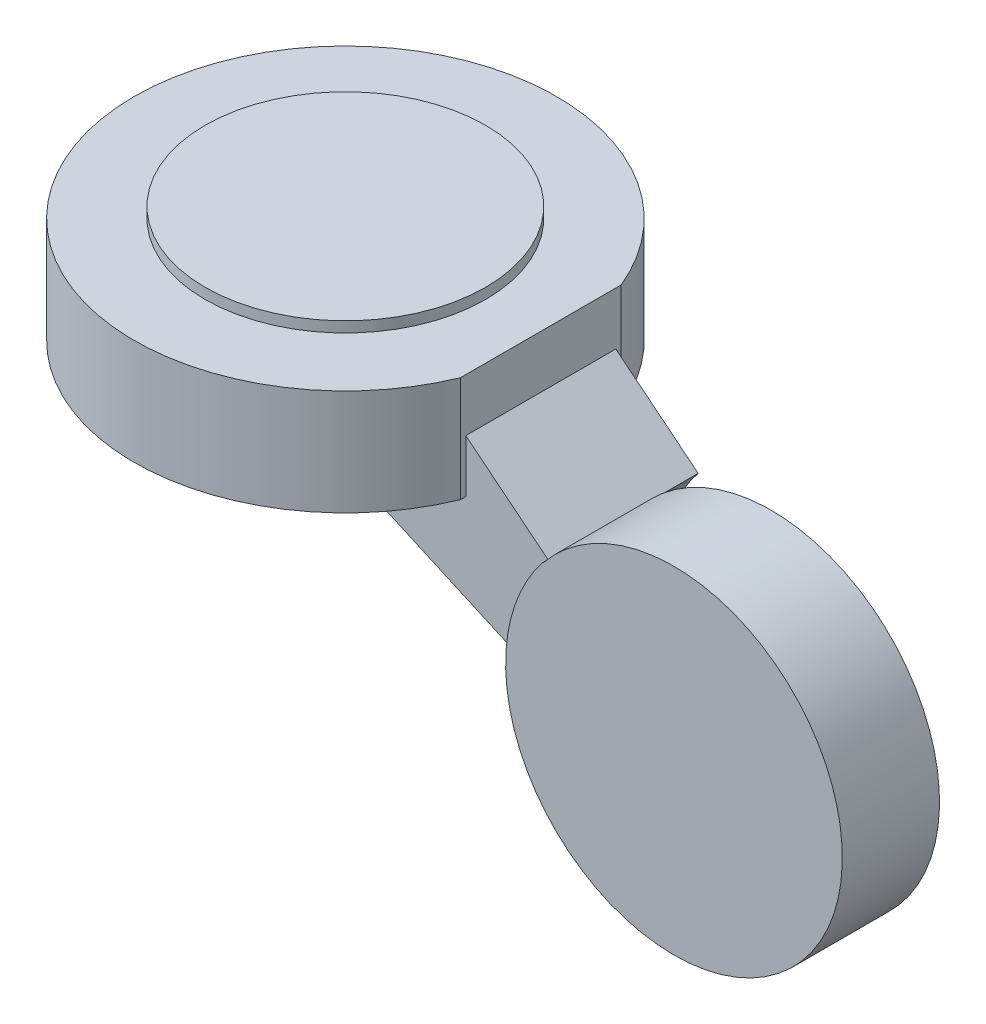
ISO-10303-21;
HEADER;
FILE_DESCRIPTION(('STEP AP214'),'2;1');
FILE_NAME('part.step','',(''),(''),'','','');
FILE_SCHEMA(('AUTOMOTIVE_DESIGN { 1 0 10303 214 1 1 1 1 }'));
ENDSEC;
DATA;
#1=APPLICATION_CONTEXT('core data for automotive mechanical design processes');
#2=APPLICATION_PROTOCOL_DEFINITION('international standard','automotive_design',2000,#1);
#3=PRODUCT_CONTEXT('',#1,'mechanical');
#4=PRODUCT('Part','Part','',(#3));
#5=PRODUCT_RELATED_PRODUCT_CATEGORY('part','',(#4));
#6=PRODUCT_DEFINITION_FORMATION('','',#4);
#7=PRODUCT_DEFINITION_CONTEXT('part definition',#1,'design');
#8=PRODUCT_DEFINITION('design','',#6,#7);
#9=PRODUCT_DEFINITION_SHAPE('','',#8);
#10=(LENGTH_UNIT() NAMED_UNIT(*) SI_UNIT(.MILLI.,.METRE.));
#11=(NAMED_UNIT(*) PLANE_ANGLE_UNIT() SI_UNIT($,.RADIAN.));
#12=(NAMED_UNIT(*) SI_UNIT($,.STERADIAN.) SOLID_ANGLE_UNIT());
#13=UNCERTAINTY_MEASURE_WITH_UNIT(LENGTH_MEASURE(1.E-05),#10,'distance_accuracy_value','');
#14=(GEOMETRIC_REPRESENTATION_CONTEXT(3) GLOBAL_UNCERTAINTY_ASSIGNED_CONTEXT((#13)) GLOBAL_UNIT_ASSIGNED_CONTEXT((#10,
#11,#12)) REPRESENTATION_CONTEXT('',''));
#15=CARTESIAN_POINT('',(0.,0.,0.));
#16=DIRECTION('',(0.,0.,1.));
#17=DIRECTION('',(1.,0.,0.));
#18=AXIS2_PLACEMENT_3D('',#15,#16,#17);
#19=CARTESIAN_POINT('',(185.,50.,-75.9934207678534));
#20=DIRECTION('',(0.627757521800335,0.778408950246015,0.));
#21=DIRECTION('',(-0.778408950246015,0.627757521800335,0.));
#22=AXIS2_PLACEMENT_3D('',#19,#20,#21);
#23=PLANE('',#22);
#24=DIRECTION('',(0.778408950246015,-0.627757521800335,0.));
#25=VECTOR('',#24,1.);
#26=CARTESIAN_POINT('',(185.,50.,-70.9934207678534));
#27=LINE('',#26,#25);
#28=CARTESIAN_POINT('',(185.,50.,-70.9934207678534));
#29=VERTEX_POINT('',#28);
#30=CARTESIAN_POINT('',(263.016769178604,-12.9175880659524,-70.9934207678534));
#31=VERTEX_POINT('',#30);
#32=EDGE_CURVE('E56',#29,#31,#27,.T.);
#33=ORIENTED_EDGE('',*,*,#32,.F.);
#34=DIRECTION('',(0.,0.,1.));
#35=VECTOR('',#34,1.);
#36=CARTESIAN_POINT('',(185.,50.,-75.9934207678534));
#37=LINE('',#36,#35);
#38=CARTESIAN_POINT('',(185.,50.,70.9934207678534));
#39=VERTEX_POINT('',#38);
#40=EDGE_CURVE('E160',#29,#39,#37,.T.);
#41=ORIENTED_EDGE('',*,*,#40,.T.);
#42=DIRECTION('',(-0.778408950246015,0.627757521800335,0.));
#43=VECTOR('',#42,1.);
#44=CARTESIAN_POINT('',(97.3373123204079,120.696658298578,70.9934207678534));
#45=LINE('',#44,#43);
#46=CARTESIAN_POINT('',(262.770904394627,-12.7193073711596,70.9934207678534));
#47=VERTEX_POINT('',#46);
#48=EDGE_CURVE('E296',#47,#39,#45,.T.);
#49=ORIENTED_EDGE('',*,*,#48,.F.);
#50=DIRECTION('',(0.,0.,1.));
#51=VECTOR('',#50,1.);
#52=CARTESIAN_POINT('',(262.770904394627,-12.7193073711596,70.9934207678534));
#53=LINE('',#52,#51);
#54=CARTESIAN_POINT('',(262.770904394627,-12.7193073711596,75.9934207678534));
#55=VERTEX_POINT('',#54);
#56=EDGE_CURVE('E199',#47,#55,#53,.T.);
#57=ORIENTED_EDGE('',*,*,#56,.T.);
#58=DIRECTION('',(-0.778408950246015,0.627757521800335,0.));
#59=VECTOR('',#58,1.);
#60=CARTESIAN_POINT('',(185.,50.,75.9934207678534));
#61=LINE('',#60,#59);
#62=CARTESIAN_POINT('',(263.016769178604,-12.9175880659524,75.9934207678534));
#63=VERTEX_POINT('',#62);
#64=EDGE_CURVE('E155',#63,#55,#61,.T.);
#65=ORIENTED_EDGE('',*,*,#64,.F.);
#66=DIRECTION('',(0.,0.,1.));
#67=VECTOR('',#66,1.);
#68=CARTESIAN_POINT('',(263.016769178604,-12.9175880659524,-75.9934207678534));
#69=LINE('',#68,#67);
#70=CARTESIAN_POINT('',(263.016769178604,-12.9175880659524,-15.9934207678534));
#71=VERTEX_POINT('',#70);
#72=EDGE_CURVE('E148',#71,#63,#69,.T.);
#73=ORIENTED_EDGE('',*,*,#72,.F.);
#74=EDGE_CURVE('E63',#31,#71,#69,.T.);
#75=ORIENTED_EDGE('',*,*,#74,.F.);
#76=EDGE_LOOP('',(#33,#41,#49,#57,#65,#73,#75));
#77=FACE_BOUND('',#76,.T.);
#78=ADVANCED_FACE('F39',(#77),#23,.T.);
#79=CARTESIAN_POINT('',(251.92455713093,-112.966443102881,-75.9934207678534));
#80=DIRECTION('',(-0.409160689592951,-0.91246234447884,0.));
#81=DIRECTION('',(0.91246234447884,-0.409160689592951,0.));
#82=AXIS2_PLACEMENT_3D('',#79,#80,#81);
#83=PLANE('',#82);
#84=DIRECTION('',(-0.91246234447884,0.409160689592951,0.));
#85=VECTOR('',#84,1.);
#86=CARTESIAN_POINT('',(228.060355377864,-102.265406172478,-70.9934207678534));
#87=LINE('',#86,#85);
#88=CARTESIAN_POINT('',(228.060355377864,-102.265406172478,-70.9934207678534));
#89=VERTEX_POINT('',#88);
#90=CARTESIAN_POINT('',(0.,0.,-70.9934207678534));
#91=VERTEX_POINT('',#90);
#92=EDGE_CURVE('E118',#89,#91,#87,.T.);
#93=ORIENTED_EDGE('',*,*,#92,.F.);
#94=DIRECTION('',(0.,0.,1.));
#95=VECTOR('',#94,1.);
#96=CARTESIAN_POINT('',(228.060355377864,-102.265406172478,-75.9934207678534));
#97=LINE('',#96,#95);
#98=CARTESIAN_POINT('',(228.060355377864,-102.265406172478,-15.9934207678534));
#99=VERTEX_POINT('',#98);
#100=EDGE_CURVE('E128',#99,#89,#97,.F.);
#101=ORIENTED_EDGE('',*,*,#100,.F.);
#102=CARTESIAN_POINT('',(228.060355377864,-102.265406172478,70.9934207678534));
#103=VERTEX_POINT('',#102);
#104=EDGE_CURVE('E137',#103,#99,#97,.F.);
#105=ORIENTED_EDGE('',*,*,#104,.F.);
#106=DIRECTION('',(0.91246234447884,-0.409160689592951,0.));
#107=VECTOR('',#106,1.);
#108=CARTESIAN_POINT('',(0.,0.,70.9934207678534));
#109=LINE('',#108,#107);
#110=CARTESIAN_POINT('',(0.,0.,70.9934207678534));
#111=VERTEX_POINT('',#110);
#112=EDGE_CURVE('E305',#111,#103,#109,.T.);
#113=ORIENTED_EDGE('',*,*,#112,.F.);
#114=DIRECTION('',(0.,0.,1.));
#115=VECTOR('',#114,1.);
#116=CARTESIAN_POINT('',(0.,0.,-75.9934207678534));
#117=LINE('',#116,#115);
#118=EDGE_CURVE('E130',#91,#111,#117,.T.);
#119=ORIENTED_EDGE('',*,*,#118,.F.);
#120=EDGE_LOOP('',(#93,#101,#105,#113,#119));
#121=FACE_BOUND('',#120,.T.);
#122=ADVANCED_FACE('F126',(#121),#83,.T.);
#123=CARTESIAN_POINT('',(0.,0.,75.9934207678534));
#124=DIRECTION('',(0.,0.,-1.));
#125=DIRECTION('',(-1.,0.,0.));
#126=AXIS2_PLACEMENT_3D('',#123,#124,#125);
#127=PLANE('',#126);
#128=CARTESIAN_POINT('',(388.832371902994,-113.084659733468,75.9934207678534));
#129=DIRECTION('',(0.,0.,1.));
#130=DIRECTION('',(1.,0.,0.));
#131=AXIS2_PLACEMENT_3D('',#128,#129,#130);
#132=CIRCLE('',#131,161.135649516715);
#133=CARTESIAN_POINT('',(228.060355377864,-102.265406172478,75.9934207678534));
#134=VERTEX_POINT('',#133);
#135=EDGE_CURVE('E292',#55,#134,#132,.T.);
#136=ORIENTED_EDGE('',*,*,#135,.T.);
#137=CARTESIAN_POINT('',(387.075695624063,-112.966443102881,75.9934207678534));
#138=DIRECTION('',(0.,0.,1.));
#139=DIRECTION('',(1.,0.,0.));
#140=AXIS2_PLACEMENT_3D('',#137,#138,#139);
#141=CIRCLE('',#140,159.375);
#142=EDGE_CURVE('E138',#134,#63,#141,.T.);
#143=ORIENTED_EDGE('',*,*,#142,.T.);
#144=ORIENTED_EDGE('',*,*,#64,.T.);
#145=EDGE_LOOP('',(#136,#143,#144));
#146=FACE_BOUND('',#145,.T.);
#147=ADVANCED_FACE('F223',(#146),#127,.F.);
#148=CARTESIAN_POINT('',(387.075695624063,-112.966443102881,-75.9934207678534));
#149=DIRECTION('',(0.,0.,1.));
#150=DIRECTION('',(1.,0.,0.));
#151=AXIS2_PLACEMENT_3D('',#148,#149,#150);
#152=CYLINDRICAL_SURFACE('',#151,159.375);
#153=EDGE_CURVE('E140',#134,#103,#97,.F.);
#154=ORIENTED_EDGE('',*,*,#153,.T.);
#155=ORIENTED_EDGE('',*,*,#104,.T.);
#156=CARTESIAN_POINT('',(387.075695624063,-112.966443102881,-15.9934207678534));
#157=DIRECTION('',(0.,0.,-1.));
#158=DIRECTION('',(-1.,0.,0.));
#159=AXIS2_PLACEMENT_3D('',#156,#157,#158);
#160=CIRCLE('',#159,159.375);
#161=EDGE_CURVE('E43',#99,#71,#160,.F.);
#162=ORIENTED_EDGE('',*,*,#161,.T.);
#163=ORIENTED_EDGE('',*,*,#72,.T.);
#164=ORIENTED_EDGE('',*,*,#142,.F.);
#165=EDGE_LOOP('',(#154,#155,#162,#163,#164));
#166=FACE_BOUND('',#165,.T.);
#167=ADVANCED_FACE('F230',(#166),#152,.T.);
#168=CARTESIAN_POINT('',(0.,0.,0.));
#169=DIRECTION('',(0.,1.,0.));
#170=DIRECTION('',(0.,0.,1.));
#171=AXIS2_PLACEMENT_3D('',#168,#169,#170);
#172=PLANE('',#171);
#173=DIRECTION('',(1.,0.,0.));
#174=VECTOR('',#173,1.);
#175=CARTESIAN_POINT('',(0.,0.,-70.9934207678534));
#176=LINE('',#175,#174);
#177=CARTESIAN_POINT('',(185.,0.,-70.9934207678534));
#178=VERTEX_POINT('',#177);
#179=EDGE_CURVE('E132',#91,#178,#176,.T.);
#180=ORIENTED_EDGE('',*,*,#179,.F.);
#181=ORIENTED_EDGE('',*,*,#118,.T.);
#182=DIRECTION('',(-1.,0.,0.));
#183=VECTOR('',#182,1.);
#184=CARTESIAN_POINT('',(0.,0.,70.9934207678534));
#185=LINE('',#184,#183);
#186=CARTESIAN_POINT('',(185.,0.,70.9934207678534));
#187=VERTEX_POINT('',#186);
#188=EDGE_CURVE('E194',#187,#111,#185,.T.);
#189=ORIENTED_EDGE('',*,*,#188,.F.);
#190=DIRECTION('',(0.,0.,1.));
#191=VECTOR('',#190,1.);
#192=CARTESIAN_POINT('',(185.,0.,70.9934207678534));
#193=LINE('',#192,#191);
#194=CARTESIAN_POINT('',(185.,0.,75.9934207678534));
#195=VERTEX_POINT('',#194);
#196=EDGE_CURVE('E192',#187,#195,#193,.T.);
#197=ORIENTED_EDGE('',*,*,#196,.T.);
#198=CARTESIAN_POINT('',(0.,0.,0.));
#199=DIRECTION('',(0.,1.,0.));
#200=DIRECTION('',(0.,0.,1.));
#201=AXIS2_PLACEMENT_3D('',#198,#199,#200);
#202=CIRCLE('',#201,200.);
#203=CARTESIAN_POINT('',(185.,0.,-75.9934207678534));
#204=VERTEX_POINT('',#203);
#205=EDGE_CURVE('E173',#204,#195,#202,.T.);
#206=ORIENTED_EDGE('',*,*,#205,.F.);
#207=DIRECTION('',(0.,0.,-1.));
#208=VECTOR('',#207,1.);
#209=CARTESIAN_POINT('',(185.,0.,-70.9934207678534));
#210=LINE('',#209,#208);
#211=EDGE_CURVE('E189',#178,#204,#210,.T.);
#212=ORIENTED_EDGE('',*,*,#211,.F.);
#213=EDGE_LOOP('',(#180,#181,#189,#197,#206,#212));
#214=FACE_BOUND('',#213,.T.);
#215=ADVANCED_FACE('F188',(#214),#172,.F.);
#216=CARTESIAN_POINT('',(185.,0.,0.));
#217=DIRECTION('',(1.,0.,0.));
#218=DIRECTION('',(0.,0.,-1.));
#219=AXIS2_PLACEMENT_3D('',#216,#217,#218);
#220=PLANE('',#219);
#221=DIRECTION('',(0.,0.,-1.));
#222=VECTOR('',#221,1.);
#223=CARTESIAN_POINT('',(185.,100.,0.));
#224=LINE('',#223,#222);
#225=CARTESIAN_POINT('',(185.,100.,75.9934207678534));
#226=VERTEX_POINT('',#225);
#227=CARTESIAN_POINT('',(185.,100.,-75.9934207678534));
#228=VERTEX_POINT('',#227);
#229=EDGE_CURVE('E163',#226,#228,#224,.T.);
#230=ORIENTED_EDGE('',*,*,#229,.F.);
#231=DIRECTION('',(0.,1.,0.));
#232=VECTOR('',#231,1.);
#233=CARTESIAN_POINT('',(185.,0.,75.9934207678534));
#234=LINE('',#233,#232);
#235=EDGE_CURVE('E169',#195,#226,#234,.T.);
#236=ORIENTED_EDGE('',*,*,#235,.F.);
#237=ORIENTED_EDGE('',*,*,#196,.F.);
#238=DIRECTION('',(0.,-1.,0.));
#239=VECTOR('',#238,1.);
#240=CARTESIAN_POINT('',(185.,0.,70.9934207678534));
#241=LINE('',#240,#239);
#242=EDGE_CURVE('E300',#39,#187,#241,.T.);
#243=ORIENTED_EDGE('',*,*,#242,.F.);
#244=ORIENTED_EDGE('',*,*,#40,.F.);
#245=DIRECTION('',(0.,1.,0.));
#246=VECTOR('',#245,1.);
#247=CARTESIAN_POINT('',(185.,0.,-70.9934207678534));
#248=LINE('',#247,#246);
#249=EDGE_CURVE('E285',#178,#29,#248,.T.);
#250=ORIENTED_EDGE('',*,*,#249,.F.);
#251=ORIENTED_EDGE('',*,*,#211,.T.);
#252=DIRECTION('',(0.,1.,0.));
#253=VECTOR('',#252,1.);
#254=CARTESIAN_POINT('',(185.,0.,-75.9934207678534));
#255=LINE('',#254,#253);
#256=EDGE_CURVE('E170',#204,#228,#255,.T.);
#257=ORIENTED_EDGE('',*,*,#256,.T.);
#258=EDGE_LOOP('',(#230,#236,#237,#243,#244,#250,#251,#257));
#259=FACE_BOUND('',#258,.T.);
#260=ADVANCED_FACE('F201',(#259),#220,.T.);
#261=CARTESIAN_POINT('',(0.,100.,0.));
#262=DIRECTION('',(0.,-1.,0.));
#263=DIRECTION('',(0.,0.,-1.));
#264=AXIS2_PLACEMENT_3D('',#261,#262,#263);
#265=CYLINDRICAL_SURFACE('',#264,200.);
#266=ORIENTED_EDGE('',*,*,#235,.T.);
#267=CARTESIAN_POINT('',(0.,100.,0.));
#268=DIRECTION('',(0.,1.,0.));
#269=DIRECTION('',(0.,0.,1.));
#270=AXIS2_PLACEMENT_3D('',#267,#268,#269);
#271=CIRCLE('',#270,200.);
#272=EDGE_CURVE('E176',#228,#226,#271,.T.);
#273=ORIENTED_EDGE('',*,*,#272,.F.);
#274=ORIENTED_EDGE('',*,*,#256,.F.);
#275=ORIENTED_EDGE('',*,*,#205,.T.);
#276=EDGE_LOOP('',(#266,#273,#274,#275));
#277=FACE_BOUND('',#276,.T.);
#278=ADVANCED_FACE('F41',(#277),#265,.T.);
#279=CARTESIAN_POINT('',(0.,100.,0.));
#280=DIRECTION('',(0.,1.,0.));
#281=DIRECTION('',(0.,0.,1.));
#282=AXIS2_PLACEMENT_3D('',#279,#280,#281);
#283=PLANE('',#282);
#284=CARTESIAN_POINT('',(0.,100.,0.));
#285=DIRECTION('',(0.,1.,0.));
#286=DIRECTION('',(0.,0.,1.));
#287=AXIS2_PLACEMENT_3D('',#284,#285,#286);
#288=CIRCLE('',#287,132.8125);
#289=CARTESIAN_POINT('',(0.,100.,132.8125));
#290=VERTEX_POINT('',#289);
#291=EDGE_CURVE('E11',#290,#290,#288,.T.);
#292=ORIENTED_EDGE('',*,*,#291,.F.);
#293=EDGE_LOOP('',(#292));
#294=FACE_BOUND('',#293,.T.);
#295=ORIENTED_EDGE('',*,*,#272,.T.);
#296=ORIENTED_EDGE('',*,*,#229,.T.);
#297=EDGE_LOOP('',(#295,#296));
#298=FACE_BOUND('',#297,.T.);
#299=ADVANCED_FACE('F203',(#294,#298),#283,.T.);
#300=CARTESIAN_POINT('',(387.075695624062,-112.966443102881,-15.9934207678534));
#301=DIRECTION('',(0.,0.,-1.));
#302=DIRECTION('',(-1.,0.,0.));
#303=AXIS2_PLACEMENT_3D('',#300,#301,#302);
#304=CYLINDRICAL_SURFACE('',#303,159.375);
#305=ORIENTED_EDGE('',*,*,#100,.T.);
#306=CARTESIAN_POINT('',(387.075695624063,-112.966443102881,-70.9934207678534));
#307=DIRECTION('',(0.,0.,1.));
#308=DIRECTION('',(1.,0.,0.));
#309=AXIS2_PLACEMENT_3D('',#306,#307,#308);
#310=CIRCLE('',#309,159.375000000001);
#311=EDGE_CURVE('E114',#31,#89,#310,.T.);
#312=ORIENTED_EDGE('',*,*,#311,.F.);
#313=ORIENTED_EDGE('',*,*,#74,.T.);
#314=CARTESIAN_POINT('',(387.075695624062,-112.966443102881,-15.9934207678534));
#315=DIRECTION('',(0.,0.,-1.));
#316=DIRECTION('',(-1.,0.,0.));
#317=AXIS2_PLACEMENT_3D('',#314,#315,#316);
#318=CIRCLE('',#317,159.375);
#319=EDGE_CURVE('E135',#99,#71,#318,.T.);
#320=ORIENTED_EDGE('',*,*,#319,.F.);
#321=EDGE_LOOP('',(#305,#312,#313,#320));
#322=FACE_BOUND('',#321,.T.);
#323=ADVANCED_FACE('F134',(#322),#304,.F.);
#324=CARTESIAN_POINT('',(387.075695624062,-112.966443102881,-15.9934207678534));
#325=DIRECTION('',(0.,0.,-1.));
#326=DIRECTION('',(-1.,0.,0.));
#327=AXIS2_PLACEMENT_3D('',#324,#325,#326);
#328=PLANE('',#327);
#329=CARTESIAN_POINT('',(387.075695624063,-112.966443102881,-15.9934207678534));
#330=DIRECTION('',(0.,0.,-1.));
#331=DIRECTION('',(-1.,0.,0.));
#332=AXIS2_PLACEMENT_3D('',#329,#330,#331);
#333=CIRCLE('',#332,132.8125);
#334=CARTESIAN_POINT('',(254.263195624063,-112.966443102881,-15.9934207678534));
#335=VERTEX_POINT('',#334);
#336=EDGE_CURVE('E274',#335,#335,#333,.T.);
#337=ORIENTED_EDGE('',*,*,#336,.F.);
#338=EDGE_LOOP('',(#337));
#339=FACE_BOUND('',#338,.T.);
#340=ORIENTED_EDGE('',*,*,#319,.T.);
#341=ORIENTED_EDGE('',*,*,#161,.F.);
#342=EDGE_LOOP('',(#340,#341));
#343=FACE_BOUND('',#342,.T.);
#344=ADVANCED_FACE('F212',(#339,#343),#328,.T.);
#345=CARTESIAN_POINT('',(388.832371902994,-113.084659733468,70.9934207678534));
#346=DIRECTION('',(0.,0.,1.));
#347=DIRECTION('',(1.,0.,0.));
#348=AXIS2_PLACEMENT_3D('',#345,#346,#347);
#349=CYLINDRICAL_SURFACE('',#348,161.135649516715);
#350=ORIENTED_EDGE('',*,*,#135,.F.);
#351=ORIENTED_EDGE('',*,*,#56,.F.);
#352=CARTESIAN_POINT('',(388.832371902994,-113.084659733468,70.9934207678534));
#353=DIRECTION('',(0.,0.,1.));
#354=DIRECTION('',(1.,0.,0.));
#355=AXIS2_PLACEMENT_3D('',#352,#353,#354);
#356=CIRCLE('',#355,161.135649516715);
#357=EDGE_CURVE('E293',#47,#103,#356,.T.);
#358=ORIENTED_EDGE('',*,*,#357,.T.);
#359=ORIENTED_EDGE('',*,*,#153,.F.);
#360=EDGE_LOOP('',(#350,#351,#358,#359));
#361=FACE_BOUND('',#360,.T.);
#362=ADVANCED_FACE('F242',(#361),#349,.T.);
#363=CARTESIAN_POINT('',(0.,0.,70.9934207678534));
#364=DIRECTION('',(0.,0.,1.));
#365=DIRECTION('',(1.,0.,0.));
#366=AXIS2_PLACEMENT_3D('',#363,#364,#365);
#367=PLANE('',#366);
#368=ORIENTED_EDGE('',*,*,#357,.F.);
#369=ORIENTED_EDGE('',*,*,#48,.T.);
#370=ORIENTED_EDGE('',*,*,#242,.T.);
#371=ORIENTED_EDGE('',*,*,#188,.T.);
#372=ORIENTED_EDGE('',*,*,#112,.T.);
#373=EDGE_LOOP('',(#368,#369,#370,#371,#372));
#374=FACE_BOUND('',#373,.T.);
#375=ADVANCED_FACE('F246',(#374),#367,.T.);
#376=CARTESIAN_POINT('',(387.075695624063,-112.966443102881,-70.9934207678534));
#377=DIRECTION('',(0.,0.,1.));
#378=DIRECTION('',(1.,0.,0.));
#379=AXIS2_PLACEMENT_3D('',#376,#377,#378);
#380=PLANE('',#379);
#381=ORIENTED_EDGE('',*,*,#311,.T.);
#382=ORIENTED_EDGE('',*,*,#92,.T.);
#383=ORIENTED_EDGE('',*,*,#179,.T.);
#384=ORIENTED_EDGE('',*,*,#249,.T.);
#385=ORIENTED_EDGE('',*,*,#32,.T.);
#386=EDGE_LOOP('',(#381,#382,#383,#384,#385));
#387=FACE_BOUND('',#386,.T.);
#388=ADVANCED_FACE('F116',(#387),#380,.F.);
#389=CARTESIAN_POINT('',(387.075695624063,-112.966443102881,-25.9934207678534));
#390=DIRECTION('',(0.,0.,1.));
#391=DIRECTION('',(1.,0.,0.));
#392=AXIS2_PLACEMENT_3D('',#389,#390,#391);
#393=CYLINDRICAL_SURFACE('',#392,132.8125);
#394=CARTESIAN_POINT('',(387.075695624063,-112.966443102881,-25.9934207678534));
#395=DIRECTION('',(0.,0.,-1.));
#396=DIRECTION('',(-1.,0.,0.));
#397=AXIS2_PLACEMENT_3D('',#394,#395,#396);
#398=CIRCLE('',#397,132.8125);
#399=CARTESIAN_POINT('',(254.263195624063,-112.966443102881,-25.9934207678534));
#400=VERTEX_POINT('',#399);
#401=EDGE_CURVE('E122',#400,#400,#398,.T.);
#402=ORIENTED_EDGE('',*,*,#401,.F.);
#403=EDGE_LOOP('',(#402));
#404=FACE_BOUND('',#403,.T.);
#405=ORIENTED_EDGE('',*,*,#336,.T.);
#406=EDGE_LOOP('',(#405));
#407=FACE_BOUND('',#406,.T.);
#408=ADVANCED_FACE('F253',(#404,#407),#393,.T.);
#409=CARTESIAN_POINT('',(387.075695624063,-112.966443102881,-25.9934207678534));
#410=DIRECTION('',(0.,0.,-1.));
#411=DIRECTION('',(-1.,0.,0.));
#412=AXIS2_PLACEMENT_3D('',#409,#410,#411);
#413=PLANE('',#412);
#414=ORIENTED_EDGE('',*,*,#401,.T.);
#415=EDGE_LOOP('',(#414));
#416=FACE_BOUND('',#415,.T.);
#417=ADVANCED_FACE('F256',(#416),#413,.T.);
#418=CARTESIAN_POINT('',(0.,110.,0.));
#419=DIRECTION('',(0.,-1.,0.));
#420=DIRECTION('',(0.,0.,-1.));
#421=AXIS2_PLACEMENT_3D('',#418,#419,#420);
#422=CYLINDRICAL_SURFACE('',#421,132.8125);
#423=CARTESIAN_POINT('',(0.,110.,0.));
#424=DIRECTION('',(0.,1.,0.));
#425=DIRECTION('',(0.,0.,1.));
#426=AXIS2_PLACEMENT_3D('',#423,#424,#425);
#427=CIRCLE('',#426,132.8125);
#428=CARTESIAN_POINT('',(0.,110.,132.8125));
#429=VERTEX_POINT('',#428);
#430=EDGE_CURVE('E272',#429,#429,#427,.T.);
#431=ORIENTED_EDGE('',*,*,#430,.F.);
#432=EDGE_LOOP('',(#431));
#433=FACE_BOUND('',#432,.T.);
#434=ORIENTED_EDGE('',*,*,#291,.T.);
#435=EDGE_LOOP('',(#434));
#436=FACE_BOUND('',#435,.T.);
#437=ADVANCED_FACE('F260',(#433,#436),#422,.T.);
#438=CARTESIAN_POINT('',(0.,110.,0.));
#439=DIRECTION('',(0.,1.,0.));
#440=DIRECTION('',(0.,0.,1.));
#441=AXIS2_PLACEMENT_3D('',#438,#439,#440);
#442=PLANE('',#441);
#443=ORIENTED_EDGE('',*,*,#430,.T.);
#444=EDGE_LOOP('',(#443));
#445=FACE_BOUND('',#444,.T.);
#446=ADVANCED_FACE('F264',(#445),#442,.T.);
#447=CLOSED_SHELL('',(#78,#122,#147,#167,#215,#260,#278,#299,#323,#344,#362,#375,#388,#408,#417,
#437,#446));
#448=MANIFOLD_SOLID_BREP('B2',#447);
#449=ADVANCED_BREP_SHAPE_REPRESENTATION('',(#18,#448),#14);
#450=SHAPE_DEFINITION_REPRESENTATION(#9,#449);
ENDSEC;
END-ISO-10303-21;
